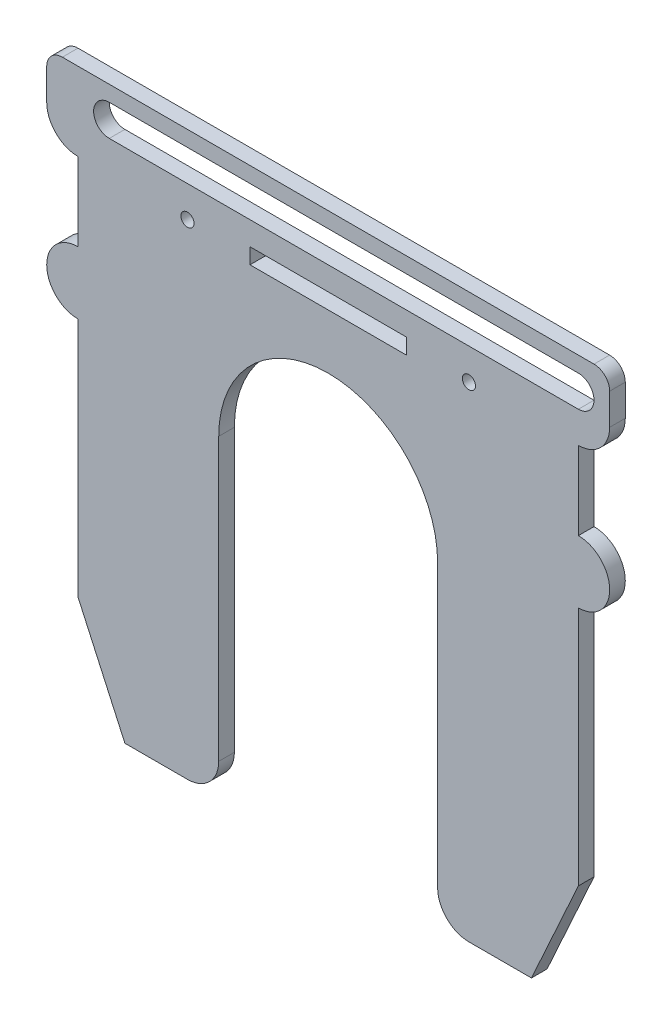
ISO-10303-21;
HEADER;
FILE_DESCRIPTION(('STEP AP214'),'2;1');
FILE_NAME('part.step','',(''),(''),'','','');
FILE_SCHEMA(('AUTOMOTIVE_DESIGN { 1 0 10303 214 1 1 1 1 }'));
ENDSEC;
DATA;
#1=APPLICATION_CONTEXT('core data for automotive mechanical design processes');
#2=APPLICATION_PROTOCOL_DEFINITION('international standard','automotive_design',2000,#1);
#3=PRODUCT_CONTEXT('',#1,'mechanical');
#4=PRODUCT('Part','Part','',(#3));
#5=PRODUCT_RELATED_PRODUCT_CATEGORY('part','',(#4));
#6=PRODUCT_DEFINITION_FORMATION('','',#4);
#7=PRODUCT_DEFINITION_CONTEXT('part definition',#1,'design');
#8=PRODUCT_DEFINITION('design','',#6,#7);
#9=PRODUCT_DEFINITION_SHAPE('','',#8);
#10=(LENGTH_UNIT() NAMED_UNIT(*) SI_UNIT(.MILLI.,.METRE.));
#11=(NAMED_UNIT(*) PLANE_ANGLE_UNIT() SI_UNIT($,.RADIAN.));
#12=(NAMED_UNIT(*) SI_UNIT($,.STERADIAN.) SOLID_ANGLE_UNIT());
#13=UNCERTAINTY_MEASURE_WITH_UNIT(LENGTH_MEASURE(1.E-05),#10,'distance_accuracy_value','');
#14=(GEOMETRIC_REPRESENTATION_CONTEXT(3) GLOBAL_UNCERTAINTY_ASSIGNED_CONTEXT((#13)) GLOBAL_UNIT_ASSIGNED_CONTEXT((#10,
#11,#12)) REPRESENTATION_CONTEXT('',''));
#15=CARTESIAN_POINT('',(0.,0.,0.));
#16=DIRECTION('',(0.,0.,1.));
#17=DIRECTION('',(1.,0.,0.));
#18=AXIS2_PLACEMENT_3D('',#15,#16,#17);
#19=CARTESIAN_POINT('',(-170.,155.,-5.));
#20=DIRECTION('',(1.,0.,0.));
#21=DIRECTION('',(0.,0.,-1.));
#22=AXIS2_PLACEMENT_3D('',#19,#20,#21);
#23=PLANE('',#22);
#24=DIRECTION('',(0.,0.,1.));
#25=VECTOR('',#24,1.);
#26=CARTESIAN_POINT('',(-170.,130.,0.));
#27=LINE('',#26,#25);
#28=CARTESIAN_POINT('',(-170.,130.,0.));
#29=VERTEX_POINT('',#28);
#30=CARTESIAN_POINT('',(-170.,130.,5.));
#31=VERTEX_POINT('',#30);
#32=EDGE_CURVE('E247',#29,#31,#27,.T.);
#33=ORIENTED_EDGE('',*,*,#32,.T.);
#34=DIRECTION('',(0.,1.,0.));
#35=VECTOR('',#34,1.);
#36=CARTESIAN_POINT('',(-170.,155.,5.));
#37=LINE('',#36,#35);
#38=CARTESIAN_POINT('',(-170.,155.,5.));
#39=VERTEX_POINT('',#38);
#40=EDGE_CURVE('E233',#31,#39,#37,.T.);
#41=ORIENTED_EDGE('',*,*,#40,.T.);
#42=DIRECTION('',(0.,0.,1.));
#43=VECTOR('',#42,1.);
#44=CARTESIAN_POINT('',(-170.,155.,-5.));
#45=LINE('',#44,#43);
#46=CARTESIAN_POINT('',(-170.,155.,0.));
#47=VERTEX_POINT('',#46);
#48=EDGE_CURVE('E274',#47,#39,#45,.T.);
#49=ORIENTED_EDGE('',*,*,#48,.F.);
#50=DIRECTION('',(0.,1.,0.));
#51=VECTOR('',#50,1.);
#52=CARTESIAN_POINT('',(-170.,175.,0.));
#53=LINE('',#52,#51);
#54=EDGE_CURVE('E50',#29,#47,#53,.T.);
#55=ORIENTED_EDGE('',*,*,#54,.F.);
#56=EDGE_LOOP('',(#33,#41,#49,#55));
#57=FACE_BOUND('',#56,.T.);
#58=ADVANCED_FACE('F35',(#57),#23,.F.);
#59=DIRECTION('',(0.,0.,1.));
#60=VECTOR('',#59,1.);
#61=CARTESIAN_POINT('',(-170.,110.,0.));
#62=LINE('',#61,#60);
#63=CARTESIAN_POINT('',(-170.,110.,0.));
#64=VERTEX_POINT('',#63);
#65=CARTESIAN_POINT('',(-170.,110.,5.));
#66=VERTEX_POINT('',#65);
#67=EDGE_CURVE('E58',#64,#66,#62,.T.);
#68=ORIENTED_EDGE('',*,*,#67,.F.);
#69=CARTESIAN_POINT('',(-170.,33.,0.));
#70=VERTEX_POINT('',#69);
#71=EDGE_CURVE('E276',#70,#64,#53,.T.);
#72=ORIENTED_EDGE('',*,*,#71,.F.);
#73=DIRECTION('',(0.,0.,-1.));
#74=VECTOR('',#73,1.);
#75=CARTESIAN_POINT('',(-170.,33.,-5.));
#76=LINE('',#75,#74);
#77=CARTESIAN_POINT('',(-170.,33.,5.));
#78=VERTEX_POINT('',#77);
#79=EDGE_CURVE('E456',#78,#70,#76,.T.);
#80=ORIENTED_EDGE('',*,*,#79,.F.);
#81=EDGE_CURVE('E243',#78,#66,#37,.T.);
#82=ORIENTED_EDGE('',*,*,#81,.T.);
#83=EDGE_LOOP('',(#68,#72,#80,#82));
#84=FACE_BOUND('',#83,.T.);
#85=ADVANCED_FACE('F506',(#84),#23,.F.);
#86=CARTESIAN_POINT('',(-10.,155.,-5.));
#87=DIRECTION('',(-1.,0.,0.));
#88=DIRECTION('',(0.,-1.,0.));
#89=AXIS2_PLACEMENT_3D('',#86,#87,#88);
#90=PLANE('',#89);
#91=DIRECTION('',(0.,-1.,0.));
#92=VECTOR('',#91,1.);
#93=CARTESIAN_POINT('',(-10.,175.,0.));
#94=LINE('',#93,#92);
#95=CARTESIAN_POINT('',(-9.99999999999999,110.,0.));
#96=VERTEX_POINT('',#95);
#97=CARTESIAN_POINT('',(-9.99999999999998,33.,0.));
#98=VERTEX_POINT('',#97);
#99=EDGE_CURVE('E278',#96,#98,#94,.T.);
#100=ORIENTED_EDGE('',*,*,#99,.F.);
#101=DIRECTION('',(0.,0.,1.));
#102=VECTOR('',#101,1.);
#103=CARTESIAN_POINT('',(-10.,110.,0.));
#104=LINE('',#103,#102);
#105=CARTESIAN_POINT('',(-10.,110.,5.));
#106=VERTEX_POINT('',#105);
#107=EDGE_CURVE('E244',#96,#106,#104,.T.);
#108=ORIENTED_EDGE('',*,*,#107,.T.);
#109=DIRECTION('',(0.,-1.,0.));
#110=VECTOR('',#109,1.);
#111=CARTESIAN_POINT('',(-10.,155.,5.));
#112=LINE('',#111,#110);
#113=CARTESIAN_POINT('',(-9.99999999999999,33.,5.));
#114=VERTEX_POINT('',#113);
#115=EDGE_CURVE('E271',#106,#114,#112,.T.);
#116=ORIENTED_EDGE('',*,*,#115,.T.);
#117=DIRECTION('',(0.,0.,1.));
#118=VECTOR('',#117,1.);
#119=CARTESIAN_POINT('',(-9.99999999999999,33.,-5.));
#120=LINE('',#119,#118);
#121=EDGE_CURVE('E459',#98,#114,#120,.T.);
#122=ORIENTED_EDGE('',*,*,#121,.F.);
#123=EDGE_LOOP('',(#100,#108,#116,#122));
#124=FACE_BOUND('',#123,.T.);
#125=ADVANCED_FACE('F552',(#124),#90,.F.);
#126=CARTESIAN_POINT('',(-5.,175.,5.));
#127=DIRECTION('',(0.,0.,1.));
#128=DIRECTION('',(1.,0.,0.));
#129=AXIS2_PLACEMENT_3D('',#126,#127,#128);
#130=PLANE('',#129);
#131=CARTESIAN_POINT('',(-10.,155.,5.));
#132=VERTEX_POINT('',#131);
#133=CARTESIAN_POINT('',(-10.,130.,5.));
#134=VERTEX_POINT('',#133);
#135=EDGE_CURVE('E268',#132,#134,#112,.T.);
#136=ORIENTED_EDGE('',*,*,#135,.F.);
#137=CARTESIAN_POINT('',(-10.,165.,5.));
#138=DIRECTION('',(0.,0.,1.));
#139=DIRECTION('',(1.,0.,0.));
#140=AXIS2_PLACEMENT_3D('',#137,#138,#139);
#141=CIRCLE('',#140,10.);
#142=CARTESIAN_POINT('',(0.,165.,5.));
#143=VERTEX_POINT('',#142);
#144=EDGE_CURVE('E463',#132,#143,#141,.T.);
#145=ORIENTED_EDGE('',*,*,#144,.T.);
#146=DIRECTION('',(0.,1.,0.));
#147=VECTOR('',#146,1.);
#148=CARTESIAN_POINT('',(0.,10.0000000000001,5.));
#149=LINE('',#148,#147);
#150=CARTESIAN_POINT('',(0.,175.,5.));
#151=VERTEX_POINT('',#150);
#152=EDGE_CURVE('E380',#143,#151,#149,.T.);
#153=ORIENTED_EDGE('',*,*,#152,.T.);
#154=CARTESIAN_POINT('',(-5.,175.,5.));
#155=DIRECTION('',(0.,0.,1.));
#156=DIRECTION('',(1.,0.,0.));
#157=AXIS2_PLACEMENT_3D('',#154,#155,#156);
#158=CIRCLE('',#157,5.);
#159=CARTESIAN_POINT('',(-5.,180.,5.));
#160=VERTEX_POINT('',#159);
#161=EDGE_CURVE('E355',#151,#160,#158,.T.);
#162=ORIENTED_EDGE('',*,*,#161,.T.);
#163=DIRECTION('',(-1.,0.,0.));
#164=VECTOR('',#163,1.);
#165=CARTESIAN_POINT('',(-5.,180.,5.));
#166=LINE('',#165,#164);
#167=CARTESIAN_POINT('',(-175.,180.,5.));
#168=VERTEX_POINT('',#167);
#169=EDGE_CURVE('E358',#160,#168,#166,.T.);
#170=ORIENTED_EDGE('',*,*,#169,.T.);
#171=CARTESIAN_POINT('',(-175.,175.,5.));
#172=DIRECTION('',(0.,0.,1.));
#173=DIRECTION('',(1.,0.,0.));
#174=AXIS2_PLACEMENT_3D('',#171,#172,#173);
#175=CIRCLE('',#174,4.99999999999999);
#176=CARTESIAN_POINT('',(-180.,175.,5.));
#177=VERTEX_POINT('',#176);
#178=EDGE_CURVE('E361',#168,#177,#175,.T.);
#179=ORIENTED_EDGE('',*,*,#178,.T.);
#180=DIRECTION('',(0.,-1.,0.));
#181=VECTOR('',#180,1.);
#182=CARTESIAN_POINT('',(-180.,9.99999999999998,5.));
#183=LINE('',#182,#181);
#184=CARTESIAN_POINT('',(-180.,165.,5.));
#185=VERTEX_POINT('',#184);
#186=EDGE_CURVE('E363',#177,#185,#183,.T.);
#187=ORIENTED_EDGE('',*,*,#186,.T.);
#188=CARTESIAN_POINT('',(-170.,165.,5.));
#189=DIRECTION('',(0.,0.,1.));
#190=DIRECTION('',(1.,0.,0.));
#191=AXIS2_PLACEMENT_3D('',#188,#189,#190);
#192=CIRCLE('',#191,10.);
#193=EDGE_CURVE('E241',#185,#39,#192,.T.);
#194=ORIENTED_EDGE('',*,*,#193,.T.);
#195=ORIENTED_EDGE('',*,*,#40,.F.);
#196=CARTESIAN_POINT('',(-170.,120.,5.));
#197=DIRECTION('',(0.,0.,-1.));
#198=DIRECTION('',(-1.,0.,0.));
#199=AXIS2_PLACEMENT_3D('',#196,#197,#198);
#200=CIRCLE('',#199,10.);
#201=EDGE_CURVE('E239',#66,#31,#200,.T.);
#202=ORIENTED_EDGE('',*,*,#201,.F.);
#203=ORIENTED_EDGE('',*,*,#81,.F.);
#204=DIRECTION('',(-0.413802944301184,0.910366477462605,0.));
#205=VECTOR('',#204,1.);
#206=CARTESIAN_POINT('',(-155.,0.,5.));
#207=LINE('',#206,#205);
#208=CARTESIAN_POINT('',(-155.,0.,5.));
#209=VERTEX_POINT('',#208);
#210=EDGE_CURVE('E282',#209,#78,#207,.T.);
#211=ORIENTED_EDGE('',*,*,#210,.F.);
#212=DIRECTION('',(1.,0.,0.));
#213=VECTOR('',#212,1.);
#214=CARTESIAN_POINT('',(-135.,0.,5.));
#215=LINE('',#214,#213);
#216=CARTESIAN_POINT('',(-135.,0.,5.));
#217=VERTEX_POINT('',#216);
#218=EDGE_CURVE('E365',#209,#217,#215,.T.);
#219=ORIENTED_EDGE('',*,*,#218,.T.);
#220=CARTESIAN_POINT('',(-135.,10.,5.));
#221=DIRECTION('',(0.,0.,1.));
#222=DIRECTION('',(-1.,0.,0.));
#223=AXIS2_PLACEMENT_3D('',#220,#221,#222);
#224=CIRCLE('',#223,10.);
#225=CARTESIAN_POINT('',(-125.,10.,5.));
#226=VERTEX_POINT('',#225);
#227=EDGE_CURVE('E367',#217,#226,#224,.T.);
#228=ORIENTED_EDGE('',*,*,#227,.T.);
#229=DIRECTION('',(0.,1.,0.));
#230=VECTOR('',#229,1.);
#231=CARTESIAN_POINT('',(-125.,10.,5.));
#232=LINE('',#231,#230);
#233=CARTESIAN_POINT('',(-125.,100.,5.));
#234=VERTEX_POINT('',#233);
#235=EDGE_CURVE('E369',#226,#234,#232,.T.);
#236=ORIENTED_EDGE('',*,*,#235,.T.);
#237=CARTESIAN_POINT('',(-90.,100.,5.));
#238=DIRECTION('',(0.,0.,-1.));
#239=DIRECTION('',(-1.,0.,0.));
#240=AXIS2_PLACEMENT_3D('',#237,#238,#239);
#241=CIRCLE('',#240,35.);
#242=CARTESIAN_POINT('',(-55.,100.,5.));
#243=VERTEX_POINT('',#242);
#244=EDGE_CURVE('E371',#234,#243,#241,.T.);
#245=ORIENTED_EDGE('',*,*,#244,.T.);
#246=DIRECTION('',(0.,-1.,0.));
#247=VECTOR('',#246,1.);
#248=CARTESIAN_POINT('',(-55.,10.,5.));
#249=LINE('',#248,#247);
#250=CARTESIAN_POINT('',(-55.,10.,5.));
#251=VERTEX_POINT('',#250);
#252=EDGE_CURVE('E373',#243,#251,#249,.T.);
#253=ORIENTED_EDGE('',*,*,#252,.T.);
#254=CARTESIAN_POINT('',(-45.,10.,5.));
#255=DIRECTION('',(0.,0.,1.));
#256=DIRECTION('',(1.,0.,0.));
#257=AXIS2_PLACEMENT_3D('',#254,#255,#256);
#258=CIRCLE('',#257,10.);
#259=CARTESIAN_POINT('',(-45.,0.,5.));
#260=VERTEX_POINT('',#259);
#261=EDGE_CURVE('E375',#251,#260,#258,.T.);
#262=ORIENTED_EDGE('',*,*,#261,.T.);
#263=DIRECTION('',(1.,0.,0.));
#264=VECTOR('',#263,1.);
#265=CARTESIAN_POINT('',(-10.0000000000001,0.,5.));
#266=LINE('',#265,#264);
#267=CARTESIAN_POINT('',(-25.,0.,5.));
#268=VERTEX_POINT('',#267);
#269=EDGE_CURVE('E377',#260,#268,#266,.T.);
#270=ORIENTED_EDGE('',*,*,#269,.T.);
#271=DIRECTION('',(-0.413802944301184,-0.910366477462605,0.));
#272=VECTOR('',#271,1.);
#273=CARTESIAN_POINT('',(-25.,0.,5.));
#274=LINE('',#273,#272);
#275=EDGE_CURVE('E283',#114,#268,#274,.T.);
#276=ORIENTED_EDGE('',*,*,#275,.F.);
#277=ORIENTED_EDGE('',*,*,#115,.F.);
#278=CARTESIAN_POINT('',(-10.,120.,5.));
#279=DIRECTION('',(0.,0.,1.));
#280=DIRECTION('',(1.,0.,0.));
#281=AXIS2_PLACEMENT_3D('',#278,#279,#280);
#282=CIRCLE('',#281,10.);
#283=EDGE_CURVE('E250',#106,#134,#282,.T.);
#284=ORIENTED_EDGE('',*,*,#283,.T.);
#285=EDGE_LOOP('',(#136,#145,#153,#162,#170,#179,#187,#194,#195,#202,#203,#211,#219,#228,#236,
#245,#253,#262,#270,#276,#277,#284));
#286=FACE_BOUND('',#285,.T.);
#287=CARTESIAN_POINT('',(-45.,155.,5.));
#288=DIRECTION('',(0.,0.,1.));
#289=DIRECTION('',(1.,0.,0.));
#290=AXIS2_PLACEMENT_3D('',#287,#288,#289);
#291=CIRCLE('',#290,2.09999999999999);
#292=CARTESIAN_POINT('',(-42.9,155.,5.));
#293=VERTEX_POINT('',#292);
#294=EDGE_CURVE('E295',#293,#293,#291,.T.);
#295=ORIENTED_EDGE('',*,*,#294,.F.);
#296=EDGE_LOOP('',(#295));
#297=FACE_BOUND('',#296,.T.);
#298=CARTESIAN_POINT('',(-135.,155.,5.));
#299=DIRECTION('',(0.,0.,1.));
#300=DIRECTION('',(1.,0.,0.));
#301=AXIS2_PLACEMENT_3D('',#298,#299,#300);
#302=CIRCLE('',#301,2.09999999999999);
#303=CARTESIAN_POINT('',(-132.9,155.,5.));
#304=VERTEX_POINT('',#303);
#305=EDGE_CURVE('E296',#304,#304,#302,.T.);
#306=ORIENTED_EDGE('',*,*,#305,.F.);
#307=EDGE_LOOP('',(#306));
#308=FACE_BOUND('',#307,.T.);
#309=DIRECTION('',(0.,-1.,0.));
#310=VECTOR('',#309,1.);
#311=CARTESIAN_POINT('',(-115.,157.5,5.));
#312=LINE('',#311,#310);
#313=CARTESIAN_POINT('',(-115.,157.5,5.));
#314=VERTEX_POINT('',#313);
#315=CARTESIAN_POINT('',(-115.,152.5,5.));
#316=VERTEX_POINT('',#315);
#317=EDGE_CURVE('E299',#314,#316,#312,.T.);
#318=ORIENTED_EDGE('',*,*,#317,.F.);
#319=DIRECTION('',(-1.,0.,0.));
#320=VECTOR('',#319,1.);
#321=CARTESIAN_POINT('',(-115.,157.5,5.));
#322=LINE('',#321,#320);
#323=CARTESIAN_POINT('',(-65.,157.5,5.));
#324=VERTEX_POINT('',#323);
#325=EDGE_CURVE('E309',#324,#314,#322,.T.);
#326=ORIENTED_EDGE('',*,*,#325,.F.);
#327=DIRECTION('',(0.,1.,0.));
#328=VECTOR('',#327,1.);
#329=CARTESIAN_POINT('',(-65.,157.5,5.));
#330=LINE('',#329,#328);
#331=CARTESIAN_POINT('',(-65.,152.5,5.));
#332=VERTEX_POINT('',#331);
#333=EDGE_CURVE('E306',#332,#324,#330,.T.);
#334=ORIENTED_EDGE('',*,*,#333,.F.);
#335=DIRECTION('',(1.,0.,0.));
#336=VECTOR('',#335,1.);
#337=CARTESIAN_POINT('',(-115.,152.5,5.));
#338=LINE('',#337,#336);
#339=EDGE_CURVE('E303',#316,#332,#338,.T.);
#340=ORIENTED_EDGE('',*,*,#339,.F.);
#341=EDGE_LOOP('',(#318,#326,#334,#340));
#342=FACE_BOUND('',#341,.T.);
#343=DIRECTION('',(1.,0.,0.));
#344=VECTOR('',#343,1.);
#345=CARTESIAN_POINT('',(-160.,165.,5.));
#346=LINE('',#345,#344);
#347=CARTESIAN_POINT('',(-160.,165.,5.));
#348=VERTEX_POINT('',#347);
#349=CARTESIAN_POINT('',(-9.99999999999998,165.,5.));
#350=VERTEX_POINT('',#349);
#351=EDGE_CURVE('E324',#348,#350,#346,.T.);
#352=ORIENTED_EDGE('',*,*,#351,.F.);
#353=CARTESIAN_POINT('',(-160.,170.,5.));
#354=DIRECTION('',(0.,0.,1.));
#355=DIRECTION('',(1.,0.,0.));
#356=AXIS2_PLACEMENT_3D('',#353,#354,#355);
#357=CIRCLE('',#356,5.);
#358=CARTESIAN_POINT('',(-160.,175.,5.));
#359=VERTEX_POINT('',#358);
#360=EDGE_CURVE('E322',#359,#348,#357,.T.);
#361=ORIENTED_EDGE('',*,*,#360,.F.);
#362=DIRECTION('',(-1.,0.,0.));
#363=VECTOR('',#362,1.);
#364=CARTESIAN_POINT('',(-160.,175.,5.));
#365=LINE('',#364,#363);
#366=CARTESIAN_POINT('',(-9.99999999999998,175.,5.));
#367=VERTEX_POINT('',#366);
#368=EDGE_CURVE('E330',#367,#359,#365,.T.);
#369=ORIENTED_EDGE('',*,*,#368,.F.);
#370=CARTESIAN_POINT('',(-9.99999999999998,170.,5.));
#371=DIRECTION('',(0.,0.,1.));
#372=DIRECTION('',(1.,0.,0.));
#373=AXIS2_PLACEMENT_3D('',#370,#371,#372);
#374=CIRCLE('',#373,5.);
#375=EDGE_CURVE('E327',#350,#367,#374,.T.);
#376=ORIENTED_EDGE('',*,*,#375,.F.);
#377=EDGE_LOOP('',(#352,#361,#369,#376));
#378=FACE_BOUND('',#377,.T.);
#379=ADVANCED_FACE('F235',(#286,#297,#308,#342,#378),#130,.T.);
#380=CARTESIAN_POINT('',(-5.,175.,0.));
#381=DIRECTION('',(0.,0.,1.));
#382=DIRECTION('',(1.,0.,0.));
#383=AXIS2_PLACEMENT_3D('',#380,#381,#382);
#384=PLANE('',#383);
#385=CARTESIAN_POINT('',(-45.,155.,0.));
#386=DIRECTION('',(0.,0.,1.));
#387=DIRECTION('',(1.,0.,0.));
#388=AXIS2_PLACEMENT_3D('',#385,#386,#387);
#389=CIRCLE('',#388,2.09999999999999);
#390=CARTESIAN_POINT('',(-42.9,155.,0.));
#391=VERTEX_POINT('',#390);
#392=EDGE_CURVE('E337',#391,#391,#389,.T.);
#393=ORIENTED_EDGE('',*,*,#392,.T.);
#394=EDGE_LOOP('',(#393));
#395=FACE_BOUND('',#394,.T.);
#396=CARTESIAN_POINT('',(-135.,155.,0.));
#397=DIRECTION('',(0.,0.,1.));
#398=DIRECTION('',(1.,0.,0.));
#399=AXIS2_PLACEMENT_3D('',#396,#397,#398);
#400=CIRCLE('',#399,2.09999999999999);
#401=CARTESIAN_POINT('',(-132.9,155.,0.));
#402=VERTEX_POINT('',#401);
#403=EDGE_CURVE('E315',#402,#402,#400,.T.);
#404=ORIENTED_EDGE('',*,*,#403,.T.);
#405=EDGE_LOOP('',(#404));
#406=FACE_BOUND('',#405,.T.);
#407=DIRECTION('',(-1.,0.,0.));
#408=VECTOR('',#407,1.);
#409=CARTESIAN_POINT('',(-5.,157.5,0.));
#410=LINE('',#409,#408);
#411=CARTESIAN_POINT('',(-65.,157.5,0.));
#412=VERTEX_POINT('',#411);
#413=CARTESIAN_POINT('',(-115.,157.5,0.));
#414=VERTEX_POINT('',#413);
#415=EDGE_CURVE('E443',#412,#414,#410,.T.);
#416=ORIENTED_EDGE('',*,*,#415,.T.);
#417=DIRECTION('',(0.,-1.,0.));
#418=VECTOR('',#417,1.);
#419=CARTESIAN_POINT('',(-115.,175.,0.));
#420=LINE('',#419,#418);
#421=CARTESIAN_POINT('',(-115.,152.5,0.));
#422=VERTEX_POINT('',#421);
#423=EDGE_CURVE('E446',#414,#422,#420,.T.);
#424=ORIENTED_EDGE('',*,*,#423,.T.);
#425=DIRECTION('',(1.,0.,0.));
#426=VECTOR('',#425,1.);
#427=CARTESIAN_POINT('',(-5.,152.5,0.));
#428=LINE('',#427,#426);
#429=CARTESIAN_POINT('',(-65.,152.5,0.));
#430=VERTEX_POINT('',#429);
#431=EDGE_CURVE('E437',#422,#430,#428,.T.);
#432=ORIENTED_EDGE('',*,*,#431,.T.);
#433=DIRECTION('',(0.,1.,0.));
#434=VECTOR('',#433,1.);
#435=CARTESIAN_POINT('',(-65.,175.,0.));
#436=LINE('',#435,#434);
#437=EDGE_CURVE('E440',#430,#412,#436,.T.);
#438=ORIENTED_EDGE('',*,*,#437,.T.);
#439=EDGE_LOOP('',(#416,#424,#432,#438));
#440=FACE_BOUND('',#439,.T.);
#441=DIRECTION('',(0.,1.,0.));
#442=VECTOR('',#441,1.);
#443=CARTESIAN_POINT('',(0.,10.0000000000001,0.));
#444=LINE('',#443,#442);
#445=CARTESIAN_POINT('',(0.,165.,0.));
#446=VERTEX_POINT('',#445);
#447=CARTESIAN_POINT('',(0.,175.,0.));
#448=VERTEX_POINT('',#447);
#449=EDGE_CURVE('E359',#446,#448,#444,.T.);
#450=ORIENTED_EDGE('',*,*,#449,.F.);
#451=CARTESIAN_POINT('',(-10.,165.,0.));
#452=DIRECTION('',(0.,0.,1.));
#453=DIRECTION('',(1.,0.,0.));
#454=AXIS2_PLACEMENT_3D('',#451,#452,#453);
#455=CIRCLE('',#454,10.);
#456=CARTESIAN_POINT('',(-10.,155.,0.));
#457=VERTEX_POINT('',#456);
#458=EDGE_CURVE('E43',#446,#457,#455,.F.);
#459=ORIENTED_EDGE('',*,*,#458,.T.);
#460=CARTESIAN_POINT('',(-10.,130.,0.));
#461=VERTEX_POINT('',#460);
#462=EDGE_CURVE('E279',#457,#461,#94,.T.);
#463=ORIENTED_EDGE('',*,*,#462,.T.);
#464=CARTESIAN_POINT('',(-10.,120.,0.));
#465=DIRECTION('',(0.,0.,1.));
#466=DIRECTION('',(1.,0.,0.));
#467=AXIS2_PLACEMENT_3D('',#464,#465,#466);
#468=CIRCLE('',#467,10.);
#469=EDGE_CURVE('E258',#96,#461,#468,.T.);
#470=ORIENTED_EDGE('',*,*,#469,.F.);
#471=ORIENTED_EDGE('',*,*,#99,.T.);
#472=DIRECTION('',(-0.413802944301184,-0.910366477462605,0.));
#473=VECTOR('',#472,1.);
#474=CARTESIAN_POINT('',(44.3493150684932,152.568493150685,0.));
#475=LINE('',#474,#473);
#476=CARTESIAN_POINT('',(-25.,0.,0.));
#477=VERTEX_POINT('',#476);
#478=EDGE_CURVE('E288',#98,#477,#475,.T.);
#479=ORIENTED_EDGE('',*,*,#478,.T.);
#480=DIRECTION('',(1.,0.,0.));
#481=VECTOR('',#480,1.);
#482=CARTESIAN_POINT('',(-10.0000000000001,0.,0.));
#483=LINE('',#482,#481);
#484=CARTESIAN_POINT('',(-45.,0.,0.));
#485=VERTEX_POINT('',#484);
#486=EDGE_CURVE('E404',#485,#477,#483,.T.);
#487=ORIENTED_EDGE('',*,*,#486,.F.);
#488=CARTESIAN_POINT('',(-45.,10.,0.));
#489=DIRECTION('',(0.,0.,1.));
#490=DIRECTION('',(1.,0.,0.));
#491=AXIS2_PLACEMENT_3D('',#488,#489,#490);
#492=CIRCLE('',#491,10.);
#493=CARTESIAN_POINT('',(-55.,10.,0.));
#494=VERTEX_POINT('',#493);
#495=EDGE_CURVE('E402',#494,#485,#492,.T.);
#496=ORIENTED_EDGE('',*,*,#495,.F.);
#497=DIRECTION('',(0.,-1.,0.));
#498=VECTOR('',#497,1.);
#499=CARTESIAN_POINT('',(-55.,10.,0.));
#500=LINE('',#499,#498);
#501=CARTESIAN_POINT('',(-55.,100.,0.));
#502=VERTEX_POINT('',#501);
#503=EDGE_CURVE('E400',#502,#494,#500,.T.);
#504=ORIENTED_EDGE('',*,*,#503,.F.);
#505=CARTESIAN_POINT('',(-90.,100.,0.));
#506=DIRECTION('',(0.,0.,-1.));
#507=DIRECTION('',(-1.,0.,0.));
#508=AXIS2_PLACEMENT_3D('',#505,#506,#507);
#509=CIRCLE('',#508,35.);
#510=CARTESIAN_POINT('',(-125.,100.,0.));
#511=VERTEX_POINT('',#510);
#512=EDGE_CURVE('E398',#511,#502,#509,.T.);
#513=ORIENTED_EDGE('',*,*,#512,.F.);
#514=DIRECTION('',(0.,1.,0.));
#515=VECTOR('',#514,1.);
#516=CARTESIAN_POINT('',(-125.,10.,0.));
#517=LINE('',#516,#515);
#518=CARTESIAN_POINT('',(-125.,10.,0.));
#519=VERTEX_POINT('',#518);
#520=EDGE_CURVE('E396',#519,#511,#517,.T.);
#521=ORIENTED_EDGE('',*,*,#520,.F.);
#522=CARTESIAN_POINT('',(-135.,10.,0.));
#523=DIRECTION('',(0.,0.,1.));
#524=DIRECTION('',(-1.,0.,0.));
#525=AXIS2_PLACEMENT_3D('',#522,#523,#524);
#526=CIRCLE('',#525,10.);
#527=CARTESIAN_POINT('',(-135.,0.,0.));
#528=VERTEX_POINT('',#527);
#529=EDGE_CURVE('E394',#528,#519,#526,.T.);
#530=ORIENTED_EDGE('',*,*,#529,.F.);
#531=DIRECTION('',(1.,0.,0.));
#532=VECTOR('',#531,1.);
#533=CARTESIAN_POINT('',(-135.,0.,0.));
#534=LINE('',#533,#532);
#535=CARTESIAN_POINT('',(-155.,0.,0.));
#536=VERTEX_POINT('',#535);
#537=EDGE_CURVE('E392',#536,#528,#534,.T.);
#538=ORIENTED_EDGE('',*,*,#537,.F.);
#539=DIRECTION('',(-0.413802944301184,0.910366477462605,0.));
#540=VECTOR('',#539,1.);
#541=CARTESIAN_POINT('',(-195.239726027397,88.5273972602741,0.));
#542=LINE('',#541,#540);
#543=EDGE_CURVE('E292',#536,#70,#542,.T.);
#544=ORIENTED_EDGE('',*,*,#543,.T.);
#545=ORIENTED_EDGE('',*,*,#71,.T.);
#546=CARTESIAN_POINT('',(-170.,120.,0.));
#547=DIRECTION('',(0.,0.,-1.));
#548=DIRECTION('',(-1.,0.,0.));
#549=AXIS2_PLACEMENT_3D('',#546,#547,#548);
#550=CIRCLE('',#549,10.);
#551=EDGE_CURVE('E253',#64,#29,#550,.T.);
#552=ORIENTED_EDGE('',*,*,#551,.T.);
#553=ORIENTED_EDGE('',*,*,#54,.T.);
#554=CARTESIAN_POINT('',(-170.,165.,0.));
#555=DIRECTION('',(0.,0.,1.));
#556=DIRECTION('',(1.,0.,0.));
#557=AXIS2_PLACEMENT_3D('',#554,#555,#556);
#558=CIRCLE('',#557,10.);
#559=CARTESIAN_POINT('',(-180.,165.,0.));
#560=VERTEX_POINT('',#559);
#561=EDGE_CURVE('E467',#47,#560,#558,.F.);
#562=ORIENTED_EDGE('',*,*,#561,.T.);
#563=DIRECTION('',(0.,-1.,0.));
#564=VECTOR('',#563,1.);
#565=CARTESIAN_POINT('',(-180.,9.99999999999998,0.));
#566=LINE('',#565,#564);
#567=CARTESIAN_POINT('',(-180.,175.,0.));
#568=VERTEX_POINT('',#567);
#569=EDGE_CURVE('E389',#568,#560,#566,.T.);
#570=ORIENTED_EDGE('',*,*,#569,.F.);
#571=CARTESIAN_POINT('',(-175.,175.,0.));
#572=DIRECTION('',(0.,0.,1.));
#573=DIRECTION('',(1.,0.,0.));
#574=AXIS2_PLACEMENT_3D('',#571,#572,#573);
#575=CIRCLE('',#574,4.99999999999999);
#576=CARTESIAN_POINT('',(-175.,180.,0.));
#577=VERTEX_POINT('',#576);
#578=EDGE_CURVE('E387',#577,#568,#575,.T.);
#579=ORIENTED_EDGE('',*,*,#578,.F.);
#580=DIRECTION('',(-1.,0.,0.));
#581=VECTOR('',#580,1.);
#582=CARTESIAN_POINT('',(-5.,180.,0.));
#583=LINE('',#582,#581);
#584=CARTESIAN_POINT('',(-5.,180.,0.));
#585=VERTEX_POINT('',#584);
#586=EDGE_CURVE('E385',#585,#577,#583,.T.);
#587=ORIENTED_EDGE('',*,*,#586,.F.);
#588=CARTESIAN_POINT('',(-5.,175.,0.));
#589=DIRECTION('',(0.,0.,1.));
#590=DIRECTION('',(1.,0.,0.));
#591=AXIS2_PLACEMENT_3D('',#588,#589,#590);
#592=CIRCLE('',#591,5.);
#593=EDGE_CURVE('E354',#448,#585,#592,.T.);
#594=ORIENTED_EDGE('',*,*,#593,.F.);
#595=EDGE_LOOP('',(#450,#459,#463,#470,#471,#479,#487,#496,#504,#513,#521,#530,#538,#544,#545,
#552,#553,#562,#570,#579,#587,#594));
#596=FACE_BOUND('',#595,.T.);
#597=CARTESIAN_POINT('',(-160.,170.,0.));
#598=DIRECTION('',(0.,0.,1.));
#599=DIRECTION('',(1.,0.,0.));
#600=AXIS2_PLACEMENT_3D('',#597,#598,#599);
#601=CIRCLE('',#600,5.);
#602=CARTESIAN_POINT('',(-160.,175.,0.));
#603=VERTEX_POINT('',#602);
#604=CARTESIAN_POINT('',(-160.,165.,0.));
#605=VERTEX_POINT('',#604);
#606=EDGE_CURVE('E333',#603,#605,#601,.T.);
#607=ORIENTED_EDGE('',*,*,#606,.T.);
#608=DIRECTION('',(1.,0.,0.));
#609=VECTOR('',#608,1.);
#610=CARTESIAN_POINT('',(-160.,165.,0.));
#611=LINE('',#610,#609);
#612=CARTESIAN_POINT('',(-9.99999999999998,165.,0.));
#613=VERTEX_POINT('',#612);
#614=EDGE_CURVE('E336',#605,#613,#611,.T.);
#615=ORIENTED_EDGE('',*,*,#614,.T.);
#616=CARTESIAN_POINT('',(-9.99999999999998,170.,0.));
#617=DIRECTION('',(0.,0.,1.));
#618=DIRECTION('',(1.,0.,0.));
#619=AXIS2_PLACEMENT_3D('',#616,#617,#618);
#620=CIRCLE('',#619,5.);
#621=CARTESIAN_POINT('',(-9.99999999999998,175.,0.));
#622=VERTEX_POINT('',#621);
#623=EDGE_CURVE('E340',#613,#622,#620,.T.);
#624=ORIENTED_EDGE('',*,*,#623,.T.);
#625=DIRECTION('',(-1.,0.,0.));
#626=VECTOR('',#625,1.);
#627=CARTESIAN_POINT('',(-160.,175.,0.));
#628=LINE('',#627,#626);
#629=EDGE_CURVE('E325',#622,#603,#628,.T.);
#630=ORIENTED_EDGE('',*,*,#629,.T.);
#631=EDGE_LOOP('',(#607,#615,#624,#630));
#632=FACE_BOUND('',#631,.T.);
#633=ADVANCED_FACE('F472',(#395,#406,#440,#596,#632),#384,.F.);
#634=CARTESIAN_POINT('',(-5.,175.,5.));
#635=DIRECTION('',(0.,0.,-1.));
#636=DIRECTION('',(-1.,0.,0.));
#637=AXIS2_PLACEMENT_3D('',#634,#635,#636);
#638=CYLINDRICAL_SURFACE('',#637,5.);
#639=ORIENTED_EDGE('',*,*,#593,.T.);
#640=DIRECTION('',(0.,0.,-1.));
#641=VECTOR('',#640,1.);
#642=CARTESIAN_POINT('',(-5.,180.,5.));
#643=LINE('',#642,#641);
#644=EDGE_CURVE('E434',#160,#585,#643,.T.);
#645=ORIENTED_EDGE('',*,*,#644,.F.);
#646=ORIENTED_EDGE('',*,*,#161,.F.);
#647=DIRECTION('',(0.,0.,-1.));
#648=VECTOR('',#647,1.);
#649=CARTESIAN_POINT('',(0.,175.,5.));
#650=LINE('',#649,#648);
#651=EDGE_CURVE('E382',#151,#448,#650,.T.);
#652=ORIENTED_EDGE('',*,*,#651,.T.);
#653=EDGE_LOOP('',(#639,#645,#646,#652));
#654=FACE_BOUND('',#653,.T.);
#655=ADVANCED_FACE('F489',(#654),#638,.T.);
#656=CARTESIAN_POINT('',(-5.,180.,5.));
#657=DIRECTION('',(0.,-1.,0.));
#658=DIRECTION('',(1.,0.,0.));
#659=AXIS2_PLACEMENT_3D('',#656,#657,#658);
#660=PLANE('',#659);
#661=ORIENTED_EDGE('',*,*,#586,.T.);
#662=DIRECTION('',(0.,0.,-1.));
#663=VECTOR('',#662,1.);
#664=CARTESIAN_POINT('',(-175.,180.,5.));
#665=LINE('',#664,#663);
#666=EDGE_CURVE('E431',#168,#577,#665,.T.);
#667=ORIENTED_EDGE('',*,*,#666,.F.);
#668=ORIENTED_EDGE('',*,*,#169,.F.);
#669=ORIENTED_EDGE('',*,*,#644,.T.);
#670=EDGE_LOOP('',(#661,#667,#668,#669));
#671=FACE_BOUND('',#670,.T.);
#672=ADVANCED_FACE('F494',(#671),#660,.F.);
#673=CARTESIAN_POINT('',(-175.,175.,5.));
#674=DIRECTION('',(0.,0.,-1.));
#675=DIRECTION('',(-1.,0.,0.));
#676=AXIS2_PLACEMENT_3D('',#673,#674,#675);
#677=CYLINDRICAL_SURFACE('',#676,4.99999999999999);
#678=ORIENTED_EDGE('',*,*,#578,.T.);
#679=DIRECTION('',(0.,0.,-1.));
#680=VECTOR('',#679,1.);
#681=CARTESIAN_POINT('',(-180.,175.,5.));
#682=LINE('',#681,#680);
#683=EDGE_CURVE('E428',#177,#568,#682,.T.);
#684=ORIENTED_EDGE('',*,*,#683,.F.);
#685=ORIENTED_EDGE('',*,*,#178,.F.);
#686=ORIENTED_EDGE('',*,*,#666,.T.);
#687=EDGE_LOOP('',(#678,#684,#685,#686));
#688=FACE_BOUND('',#687,.T.);
#689=ADVANCED_FACE('F497',(#688),#677,.T.);
#690=CARTESIAN_POINT('',(-180.,9.99999999999998,5.));
#691=DIRECTION('',(1.,0.,0.));
#692=DIRECTION('',(0.,0.,-1.));
#693=AXIS2_PLACEMENT_3D('',#690,#691,#692);
#694=PLANE('',#693);
#695=ORIENTED_EDGE('',*,*,#569,.T.);
#696=DIRECTION('',(0.,0.,1.));
#697=VECTOR('',#696,1.);
#698=CARTESIAN_POINT('',(-180.,165.,5.));
#699=LINE('',#698,#697);
#700=EDGE_CURVE('E11',#560,#185,#699,.T.);
#701=ORIENTED_EDGE('',*,*,#700,.T.);
#702=ORIENTED_EDGE('',*,*,#186,.F.);
#703=ORIENTED_EDGE('',*,*,#683,.T.);
#704=EDGE_LOOP('',(#695,#701,#702,#703));
#705=FACE_BOUND('',#704,.T.);
#706=ADVANCED_FACE('F501',(#705),#694,.F.);
#707=CARTESIAN_POINT('',(-135.,0.,5.));
#708=DIRECTION('',(0.,1.,0.));
#709=DIRECTION('',(-1.,0.,0.));
#710=AXIS2_PLACEMENT_3D('',#707,#708,#709);
#711=PLANE('',#710);
#712=ORIENTED_EDGE('',*,*,#218,.F.);
#713=DIRECTION('',(0.,0.,-1.));
#714=VECTOR('',#713,1.);
#715=CARTESIAN_POINT('',(-155.,0.,5.));
#716=LINE('',#715,#714);
#717=EDGE_CURVE('E449',#209,#536,#716,.T.);
#718=ORIENTED_EDGE('',*,*,#717,.T.);
#719=ORIENTED_EDGE('',*,*,#537,.T.);
#720=DIRECTION('',(0.,0.,-1.));
#721=VECTOR('',#720,1.);
#722=CARTESIAN_POINT('',(-135.,0.,5.));
#723=LINE('',#722,#721);
#724=EDGE_CURVE('E425',#217,#528,#723,.T.);
#725=ORIENTED_EDGE('',*,*,#724,.F.);
#726=EDGE_LOOP('',(#712,#718,#719,#725));
#727=FACE_BOUND('',#726,.T.);
#728=ADVANCED_FACE('F513',(#727),#711,.F.);
#729=CARTESIAN_POINT('',(-135.,10.,5.));
#730=DIRECTION('',(0.,0.,-1.));
#731=DIRECTION('',(-1.,0.,0.));
#732=AXIS2_PLACEMENT_3D('',#729,#730,#731);
#733=CYLINDRICAL_SURFACE('',#732,10.);
#734=ORIENTED_EDGE('',*,*,#529,.T.);
#735=DIRECTION('',(0.,0.,-1.));
#736=VECTOR('',#735,1.);
#737=CARTESIAN_POINT('',(-125.,10.,5.));
#738=LINE('',#737,#736);
#739=EDGE_CURVE('E422',#226,#519,#738,.T.);
#740=ORIENTED_EDGE('',*,*,#739,.F.);
#741=ORIENTED_EDGE('',*,*,#227,.F.);
#742=ORIENTED_EDGE('',*,*,#724,.T.);
#743=EDGE_LOOP('',(#734,#740,#741,#742));
#744=FACE_BOUND('',#743,.T.);
#745=ADVANCED_FACE('F518',(#744),#733,.T.);
#746=CARTESIAN_POINT('',(-125.,10.,5.));
#747=DIRECTION('',(-1.,0.,0.));
#748=DIRECTION('',(0.,0.,1.));
#749=AXIS2_PLACEMENT_3D('',#746,#747,#748);
#750=PLANE('',#749);
#751=ORIENTED_EDGE('',*,*,#520,.T.);
#752=DIRECTION('',(0.,0.,-1.));
#753=VECTOR('',#752,1.);
#754=CARTESIAN_POINT('',(-125.,100.,5.));
#755=LINE('',#754,#753);
#756=EDGE_CURVE('E419',#234,#511,#755,.T.);
#757=ORIENTED_EDGE('',*,*,#756,.F.);
#758=ORIENTED_EDGE('',*,*,#235,.F.);
#759=ORIENTED_EDGE('',*,*,#739,.T.);
#760=EDGE_LOOP('',(#751,#757,#758,#759));
#761=FACE_BOUND('',#760,.T.);
#762=ADVANCED_FACE('F524',(#761),#750,.F.);
#763=CARTESIAN_POINT('',(-90.,100.,5.));
#764=DIRECTION('',(0.,0.,-1.));
#765=DIRECTION('',(-1.,0.,0.));
#766=AXIS2_PLACEMENT_3D('',#763,#764,#765);
#767=CYLINDRICAL_SURFACE('',#766,35.);
#768=ORIENTED_EDGE('',*,*,#512,.T.);
#769=DIRECTION('',(0.,0.,-1.));
#770=VECTOR('',#769,1.);
#771=CARTESIAN_POINT('',(-55.,100.,5.));
#772=LINE('',#771,#770);
#773=EDGE_CURVE('E416',#243,#502,#772,.T.);
#774=ORIENTED_EDGE('',*,*,#773,.F.);
#775=ORIENTED_EDGE('',*,*,#244,.F.);
#776=ORIENTED_EDGE('',*,*,#756,.T.);
#777=EDGE_LOOP('',(#768,#774,#775,#776));
#778=FACE_BOUND('',#777,.T.);
#779=ADVANCED_FACE('F528',(#778),#767,.F.);
#780=CARTESIAN_POINT('',(-55.,10.,5.));
#781=DIRECTION('',(1.,0.,0.));
#782=DIRECTION('',(0.,1.,0.));
#783=AXIS2_PLACEMENT_3D('',#780,#781,#782);
#784=PLANE('',#783);
#785=ORIENTED_EDGE('',*,*,#503,.T.);
#786=DIRECTION('',(0.,0.,-1.));
#787=VECTOR('',#786,1.);
#788=CARTESIAN_POINT('',(-55.,10.,5.));
#789=LINE('',#788,#787);
#790=EDGE_CURVE('E413',#251,#494,#789,.T.);
#791=ORIENTED_EDGE('',*,*,#790,.F.);
#792=ORIENTED_EDGE('',*,*,#252,.F.);
#793=ORIENTED_EDGE('',*,*,#773,.T.);
#794=EDGE_LOOP('',(#785,#791,#792,#793));
#795=FACE_BOUND('',#794,.T.);
#796=ADVANCED_FACE('F533',(#795),#784,.F.);
#797=CARTESIAN_POINT('',(-45.,10.,5.));
#798=DIRECTION('',(0.,0.,-1.));
#799=DIRECTION('',(-1.,0.,0.));
#800=AXIS2_PLACEMENT_3D('',#797,#798,#799);
#801=CYLINDRICAL_SURFACE('',#800,10.);
#802=ORIENTED_EDGE('',*,*,#495,.T.);
#803=DIRECTION('',(0.,0.,-1.));
#804=VECTOR('',#803,1.);
#805=CARTESIAN_POINT('',(-45.,0.,5.));
#806=LINE('',#805,#804);
#807=EDGE_CURVE('E410',#260,#485,#806,.T.);
#808=ORIENTED_EDGE('',*,*,#807,.F.);
#809=ORIENTED_EDGE('',*,*,#261,.F.);
#810=ORIENTED_EDGE('',*,*,#790,.T.);
#811=EDGE_LOOP('',(#802,#808,#809,#810));
#812=FACE_BOUND('',#811,.T.);
#813=ADVANCED_FACE('F539',(#812),#801,.T.);
#814=CARTESIAN_POINT('',(-10.0000000000001,0.,5.));
#815=DIRECTION('',(0.,1.,0.));
#816=DIRECTION('',(-1.,0.,0.));
#817=AXIS2_PLACEMENT_3D('',#814,#815,#816);
#818=PLANE('',#817);
#819=ORIENTED_EDGE('',*,*,#486,.T.);
#820=DIRECTION('',(0.,0.,1.));
#821=VECTOR('',#820,1.);
#822=CARTESIAN_POINT('',(-25.,0.,-5.));
#823=LINE('',#822,#821);
#824=EDGE_CURVE('E285',#477,#268,#823,.T.);
#825=ORIENTED_EDGE('',*,*,#824,.T.);
#826=ORIENTED_EDGE('',*,*,#269,.F.);
#827=ORIENTED_EDGE('',*,*,#807,.T.);
#828=EDGE_LOOP('',(#819,#825,#826,#827));
#829=FACE_BOUND('',#828,.T.);
#830=ADVANCED_FACE('F543',(#829),#818,.F.);
#831=CARTESIAN_POINT('',(0.,10.0000000000001,5.));
#832=DIRECTION('',(-1.,0.,0.));
#833=DIRECTION('',(0.,-1.,0.));
#834=AXIS2_PLACEMENT_3D('',#831,#832,#833);
#835=PLANE('',#834);
#836=ORIENTED_EDGE('',*,*,#152,.F.);
#837=DIRECTION('',(0.,0.,1.));
#838=VECTOR('',#837,1.);
#839=CARTESIAN_POINT('',(0.,165.,5.));
#840=LINE('',#839,#838);
#841=EDGE_CURVE('E465',#143,#446,#840,.F.);
#842=ORIENTED_EDGE('',*,*,#841,.T.);
#843=ORIENTED_EDGE('',*,*,#449,.T.);
#844=ORIENTED_EDGE('',*,*,#651,.F.);
#845=EDGE_LOOP('',(#836,#842,#843,#844));
#846=FACE_BOUND('',#845,.T.);
#847=ADVANCED_FACE('F485',(#846),#835,.F.);
#848=CARTESIAN_POINT('',(-160.,170.,5.));
#849=DIRECTION('',(0.,0.,-1.));
#850=DIRECTION('',(-1.,0.,0.));
#851=AXIS2_PLACEMENT_3D('',#848,#849,#850);
#852=CYLINDRICAL_SURFACE('',#851,5.);
#853=ORIENTED_EDGE('',*,*,#606,.F.);
#854=DIRECTION('',(0.,0.,-1.));
#855=VECTOR('',#854,1.);
#856=CARTESIAN_POINT('',(-160.,175.,5.));
#857=LINE('',#856,#855);
#858=EDGE_CURVE('E332',#359,#603,#857,.T.);
#859=ORIENTED_EDGE('',*,*,#858,.F.);
#860=ORIENTED_EDGE('',*,*,#360,.T.);
#861=DIRECTION('',(0.,0.,-1.));
#862=VECTOR('',#861,1.);
#863=CARTESIAN_POINT('',(-160.,165.,5.));
#864=LINE('',#863,#862);
#865=EDGE_CURVE('E351',#348,#605,#864,.T.);
#866=ORIENTED_EDGE('',*,*,#865,.T.);
#867=EDGE_LOOP('',(#853,#859,#860,#866));
#868=FACE_BOUND('',#867,.T.);
#869=ADVANCED_FACE('F608',(#868),#852,.F.);
#870=CARTESIAN_POINT('',(-160.,165.,5.));
#871=DIRECTION('',(0.,1.,0.));
#872=DIRECTION('',(0.,0.,1.));
#873=AXIS2_PLACEMENT_3D('',#870,#871,#872);
#874=PLANE('',#873);
#875=ORIENTED_EDGE('',*,*,#614,.F.);
#876=ORIENTED_EDGE('',*,*,#865,.F.);
#877=ORIENTED_EDGE('',*,*,#351,.T.);
#878=DIRECTION('',(0.,0.,-1.));
#879=VECTOR('',#878,1.);
#880=CARTESIAN_POINT('',(-9.99999999999998,165.,5.));
#881=LINE('',#880,#879);
#882=EDGE_CURVE('E349',#350,#613,#881,.T.);
#883=ORIENTED_EDGE('',*,*,#882,.T.);
#884=EDGE_LOOP('',(#875,#876,#877,#883));
#885=FACE_BOUND('',#884,.T.);
#886=ADVANCED_FACE('F604',(#885),#874,.T.);
#887=CARTESIAN_POINT('',(-9.99999999999998,170.,5.));
#888=DIRECTION('',(0.,0.,-1.));
#889=DIRECTION('',(-1.,0.,0.));
#890=AXIS2_PLACEMENT_3D('',#887,#888,#889);
#891=CYLINDRICAL_SURFACE('',#890,5.);
#892=ORIENTED_EDGE('',*,*,#623,.F.);
#893=ORIENTED_EDGE('',*,*,#882,.F.);
#894=ORIENTED_EDGE('',*,*,#375,.T.);
#895=DIRECTION('',(0.,0.,-1.));
#896=VECTOR('',#895,1.);
#897=CARTESIAN_POINT('',(-9.99999999999998,175.,5.));
#898=LINE('',#897,#896);
#899=EDGE_CURVE('E347',#367,#622,#898,.T.);
#900=ORIENTED_EDGE('',*,*,#899,.T.);
#901=EDGE_LOOP('',(#892,#893,#894,#900));
#902=FACE_BOUND('',#901,.T.);
#903=ADVANCED_FACE('F600',(#902),#891,.F.);
#904=CARTESIAN_POINT('',(-160.,175.,5.));
#905=DIRECTION('',(0.,-1.,0.));
#906=DIRECTION('',(0.,0.,-1.));
#907=AXIS2_PLACEMENT_3D('',#904,#905,#906);
#908=PLANE('',#907);
#909=ORIENTED_EDGE('',*,*,#629,.F.);
#910=ORIENTED_EDGE('',*,*,#899,.F.);
#911=ORIENTED_EDGE('',*,*,#368,.T.);
#912=ORIENTED_EDGE('',*,*,#858,.T.);
#913=EDGE_LOOP('',(#909,#910,#911,#912));
#914=FACE_BOUND('',#913,.T.);
#915=ADVANCED_FACE('F596',(#914),#908,.T.);
#916=CARTESIAN_POINT('',(-115.,157.5,-5.));
#917=DIRECTION('',(-1.,0.,0.));
#918=DIRECTION('',(0.,0.,1.));
#919=AXIS2_PLACEMENT_3D('',#916,#917,#918);
#920=PLANE('',#919);
#921=DIRECTION('',(0.,0.,1.));
#922=VECTOR('',#921,1.);
#923=CARTESIAN_POINT('',(-115.,157.5,-5.));
#924=LINE('',#923,#922);
#925=EDGE_CURVE('E313',#414,#314,#924,.T.);
#926=ORIENTED_EDGE('',*,*,#925,.T.);
#927=ORIENTED_EDGE('',*,*,#317,.T.);
#928=DIRECTION('',(0.,0.,1.));
#929=VECTOR('',#928,1.);
#930=CARTESIAN_POINT('',(-115.,152.5,-5.));
#931=LINE('',#930,#929);
#932=EDGE_CURVE('E312',#422,#316,#931,.T.);
#933=ORIENTED_EDGE('',*,*,#932,.F.);
#934=ORIENTED_EDGE('',*,*,#423,.F.);
#935=EDGE_LOOP('',(#926,#927,#933,#934));
#936=FACE_BOUND('',#935,.T.);
#937=ADVANCED_FACE('F586',(#936),#920,.F.);
#938=CARTESIAN_POINT('',(-115.,157.5,-5.));
#939=DIRECTION('',(0.,1.,0.));
#940=DIRECTION('',(0.,0.,1.));
#941=AXIS2_PLACEMENT_3D('',#938,#939,#940);
#942=PLANE('',#941);
#943=DIRECTION('',(0.,0.,1.));
#944=VECTOR('',#943,1.);
#945=CARTESIAN_POINT('',(-65.,157.5,-5.));
#946=LINE('',#945,#944);
#947=EDGE_CURVE('E316',#412,#324,#946,.T.);
#948=ORIENTED_EDGE('',*,*,#947,.T.);
#949=ORIENTED_EDGE('',*,*,#325,.T.);
#950=ORIENTED_EDGE('',*,*,#925,.F.);
#951=ORIENTED_EDGE('',*,*,#415,.F.);
#952=EDGE_LOOP('',(#948,#949,#950,#951));
#953=FACE_BOUND('',#952,.T.);
#954=ADVANCED_FACE('F582',(#953),#942,.F.);
#955=CARTESIAN_POINT('',(-65.,157.5,-5.));
#956=DIRECTION('',(1.,0.,0.));
#957=DIRECTION('',(0.,0.,-1.));
#958=AXIS2_PLACEMENT_3D('',#955,#956,#957);
#959=PLANE('',#958);
#960=DIRECTION('',(0.,0.,1.));
#961=VECTOR('',#960,1.);
#962=CARTESIAN_POINT('',(-65.,152.5,-5.));
#963=LINE('',#962,#961);
#964=EDGE_CURVE('E318',#430,#332,#963,.T.);
#965=ORIENTED_EDGE('',*,*,#964,.T.);
#966=ORIENTED_EDGE('',*,*,#333,.T.);
#967=ORIENTED_EDGE('',*,*,#947,.F.);
#968=ORIENTED_EDGE('',*,*,#437,.F.);
#969=EDGE_LOOP('',(#965,#966,#967,#968));
#970=FACE_BOUND('',#969,.T.);
#971=ADVANCED_FACE('F585',(#970),#959,.F.);
#972=CARTESIAN_POINT('',(-115.,152.5,-5.));
#973=DIRECTION('',(0.,-1.,0.));
#974=DIRECTION('',(0.,0.,-1.));
#975=AXIS2_PLACEMENT_3D('',#972,#973,#974);
#976=PLANE('',#975);
#977=ORIENTED_EDGE('',*,*,#932,.T.);
#978=ORIENTED_EDGE('',*,*,#339,.T.);
#979=ORIENTED_EDGE('',*,*,#964,.F.);
#980=ORIENTED_EDGE('',*,*,#431,.F.);
#981=EDGE_LOOP('',(#977,#978,#979,#980));
#982=FACE_BOUND('',#981,.T.);
#983=ADVANCED_FACE('F577',(#982),#976,.F.);
#984=CARTESIAN_POINT('',(-135.,155.,-5.));
#985=DIRECTION('',(0.,0.,1.));
#986=DIRECTION('',(1.,0.,0.));
#987=AXIS2_PLACEMENT_3D('',#984,#985,#986);
#988=CYLINDRICAL_SURFACE('',#987,2.09999999999999);
#989=ORIENTED_EDGE('',*,*,#305,.T.);
#990=EDGE_LOOP('',(#989));
#991=FACE_BOUND('',#990,.T.);
#992=ORIENTED_EDGE('',*,*,#403,.F.);
#993=EDGE_LOOP('',(#992));
#994=FACE_BOUND('',#993,.T.);
#995=ADVANCED_FACE('F574',(#991,#994),#988,.F.);
#996=CARTESIAN_POINT('',(-45.,155.,-5.));
#997=DIRECTION('',(0.,0.,1.));
#998=DIRECTION('',(1.,0.,0.));
#999=AXIS2_PLACEMENT_3D('',#996,#997,#998);
#1000=CYLINDRICAL_SURFACE('',#999,2.09999999999999);
#1001=ORIENTED_EDGE('',*,*,#294,.T.);
#1002=EDGE_LOOP('',(#1001));
#1003=FACE_BOUND('',#1002,.T.);
#1004=ORIENTED_EDGE('',*,*,#392,.F.);
#1005=EDGE_LOOP('',(#1004));
#1006=FACE_BOUND('',#1005,.T.);
#1007=ADVANCED_FACE('F571',(#1003,#1006),#1000,.F.);
#1008=CARTESIAN_POINT('',(-25.,0.,-5.));
#1009=DIRECTION('',(-0.910366477462605,0.413802944301184,0.));
#1010=DIRECTION('',(-0.413802944301184,-0.910366477462605,0.));
#1011=AXIS2_PLACEMENT_3D('',#1008,#1009,#1010);
#1012=PLANE('',#1011);
#1013=ORIENTED_EDGE('',*,*,#478,.F.);
#1014=ORIENTED_EDGE('',*,*,#121,.T.);
#1015=ORIENTED_EDGE('',*,*,#275,.T.);
#1016=ORIENTED_EDGE('',*,*,#824,.F.);
#1017=EDGE_LOOP('',(#1013,#1014,#1015,#1016));
#1018=FACE_BOUND('',#1017,.T.);
#1019=ADVANCED_FACE('F547',(#1018),#1012,.F.);
#1020=CARTESIAN_POINT('',(-155.,0.,-5.));
#1021=DIRECTION('',(0.910366477462605,0.413802944301184,0.));
#1022=DIRECTION('',(-0.413802944301184,0.910366477462605,0.));
#1023=AXIS2_PLACEMENT_3D('',#1020,#1021,#1022);
#1024=PLANE('',#1023);
#1025=ORIENTED_EDGE('',*,*,#210,.T.);
#1026=ORIENTED_EDGE('',*,*,#79,.T.);
#1027=ORIENTED_EDGE('',*,*,#543,.F.);
#1028=ORIENTED_EDGE('',*,*,#717,.F.);
#1029=EDGE_LOOP('',(#1025,#1026,#1027,#1028));
#1030=FACE_BOUND('',#1029,.T.);
#1031=ADVANCED_FACE('F508',(#1030),#1024,.F.);
#1032=ORIENTED_EDGE('',*,*,#135,.T.);
#1033=DIRECTION('',(0.,0.,1.));
#1034=VECTOR('',#1033,1.);
#1035=CARTESIAN_POINT('',(-10.,130.,0.));
#1036=LINE('',#1035,#1034);
#1037=EDGE_CURVE('E261',#461,#134,#1036,.T.);
#1038=ORIENTED_EDGE('',*,*,#1037,.F.);
#1039=ORIENTED_EDGE('',*,*,#462,.F.);
#1040=DIRECTION('',(0.,0.,1.));
#1041=VECTOR('',#1040,1.);
#1042=CARTESIAN_POINT('',(-10.,155.,-5.));
#1043=LINE('',#1042,#1041);
#1044=EDGE_CURVE('E270',#457,#132,#1043,.T.);
#1045=ORIENTED_EDGE('',*,*,#1044,.T.);
#1046=EDGE_LOOP('',(#1032,#1038,#1039,#1045));
#1047=FACE_BOUND('',#1046,.T.);
#1048=ADVANCED_FACE('F480',(#1047),#90,.F.);
#1049=CARTESIAN_POINT('',(-10.,165.,-5.));
#1050=DIRECTION('',(0.,0.,1.));
#1051=DIRECTION('',(1.,0.,0.));
#1052=AXIS2_PLACEMENT_3D('',#1049,#1050,#1051);
#1053=CYLINDRICAL_SURFACE('',#1052,10.);
#1054=ORIENTED_EDGE('',*,*,#458,.F.);
#1055=ORIENTED_EDGE('',*,*,#841,.F.);
#1056=ORIENTED_EDGE('',*,*,#144,.F.);
#1057=ORIENTED_EDGE('',*,*,#1044,.F.);
#1058=EDGE_LOOP('',(#1054,#1055,#1056,#1057));
#1059=FACE_BOUND('',#1058,.T.);
#1060=ADVANCED_FACE('F481',(#1059),#1053,.T.);
#1061=CARTESIAN_POINT('',(-170.,165.,5.));
#1062=DIRECTION('',(0.,0.,1.));
#1063=DIRECTION('',(1.,0.,0.));
#1064=AXIS2_PLACEMENT_3D('',#1061,#1062,#1063);
#1065=CYLINDRICAL_SURFACE('',#1064,10.);
#1066=ORIENTED_EDGE('',*,*,#561,.F.);
#1067=ORIENTED_EDGE('',*,*,#48,.T.);
#1068=ORIENTED_EDGE('',*,*,#193,.F.);
#1069=ORIENTED_EDGE('',*,*,#700,.F.);
#1070=EDGE_LOOP('',(#1066,#1067,#1068,#1069));
#1071=FACE_BOUND('',#1070,.T.);
#1072=ADVANCED_FACE('F37',(#1071),#1065,.T.);
#1073=CARTESIAN_POINT('',(-10.,120.,0.));
#1074=DIRECTION('',(0.,0.,1.));
#1075=DIRECTION('',(1.,0.,0.));
#1076=AXIS2_PLACEMENT_3D('',#1073,#1074,#1075);
#1077=CYLINDRICAL_SURFACE('',#1076,10.);
#1078=ORIENTED_EDGE('',*,*,#283,.F.);
#1079=ORIENTED_EDGE('',*,*,#107,.F.);
#1080=ORIENTED_EDGE('',*,*,#469,.T.);
#1081=ORIENTED_EDGE('',*,*,#1037,.T.);
#1082=EDGE_LOOP('',(#1078,#1079,#1080,#1081));
#1083=FACE_BOUND('',#1082,.T.);
#1084=ADVANCED_FACE('F554',(#1083),#1077,.T.);
#1085=CARTESIAN_POINT('',(-170.,120.,0.));
#1086=DIRECTION('',(0.,0.,1.));
#1087=DIRECTION('',(1.,0.,0.));
#1088=AXIS2_PLACEMENT_3D('',#1085,#1086,#1087);
#1089=CYLINDRICAL_SURFACE('',#1088,10.);
#1090=ORIENTED_EDGE('',*,*,#201,.T.);
#1091=ORIENTED_EDGE('',*,*,#32,.F.);
#1092=ORIENTED_EDGE('',*,*,#551,.F.);
#1093=ORIENTED_EDGE('',*,*,#67,.T.);
#1094=EDGE_LOOP('',(#1090,#1091,#1092,#1093));
#1095=FACE_BOUND('',#1094,.T.);
#1096=ADVANCED_FACE('F252',(#1095),#1089,.T.);
#1097=CLOSED_SHELL('',(#58,#85,#125,#379,#633,#655,#672,#689,#706,#728,#745,#762,#779,#796,#813,
#830,#847,#869,#886,#903,#915,#937,#954,#971,#983,#995,#1007,#1019,#1031,#1048,#1060,#1072,
#1084,#1096));
#1098=MANIFOLD_SOLID_BREP('B2',#1097);
#1099=ADVANCED_BREP_SHAPE_REPRESENTATION('',(#18,#1098),#14);
#1100=SHAPE_DEFINITION_REPRESENTATION(#9,#1099);
ENDSEC;
END-ISO-10303-21;
